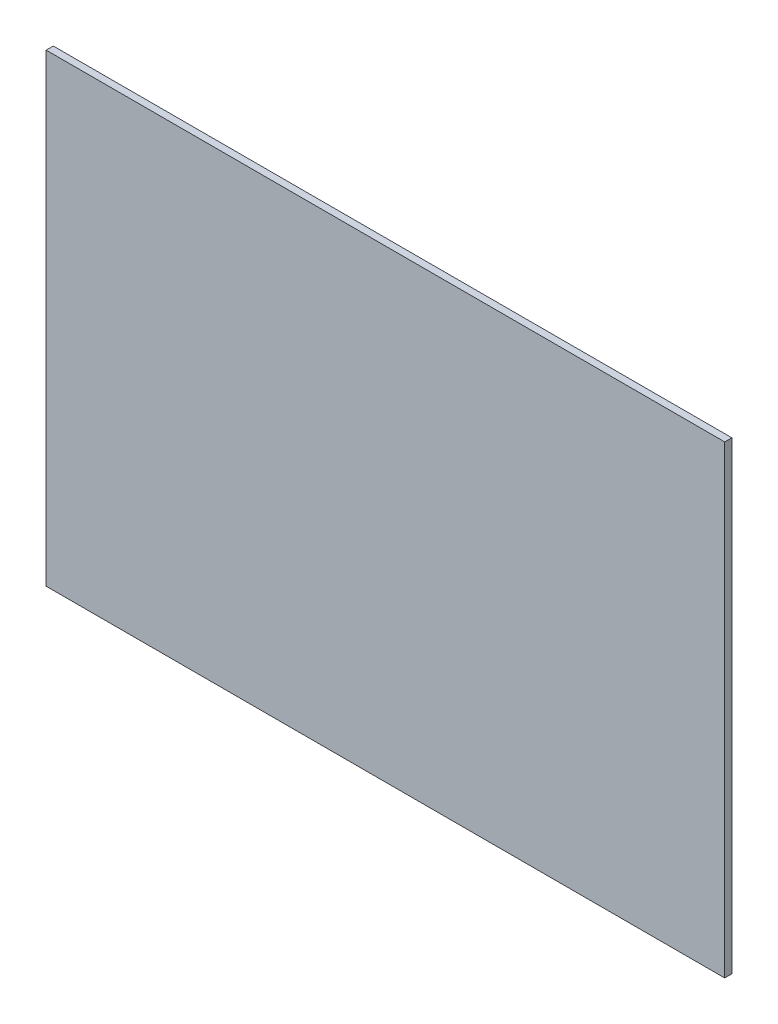
ISO-10303-21;
HEADER;
FILE_DESCRIPTION(('STEP AP214'),'2;1');
FILE_NAME('part.step','',(''),(''),'','','');
FILE_SCHEMA(('AUTOMOTIVE_DESIGN { 1 0 10303 214 1 1 1 1 }'));
ENDSEC;
DATA;
#1=APPLICATION_CONTEXT('core data for automotive mechanical design processes');
#2=APPLICATION_PROTOCOL_DEFINITION('international standard','automotive_design',2000,#1);
#3=PRODUCT_CONTEXT('',#1,'mechanical');
#4=PRODUCT('Part','Part','',(#3));
#5=PRODUCT_RELATED_PRODUCT_CATEGORY('part','',(#4));
#6=PRODUCT_DEFINITION_FORMATION('','',#4);
#7=PRODUCT_DEFINITION_CONTEXT('part definition',#1,'design');
#8=PRODUCT_DEFINITION('design','',#6,#7);
#9=PRODUCT_DEFINITION_SHAPE('','',#8);
#10=(LENGTH_UNIT() NAMED_UNIT(*) SI_UNIT(.MILLI.,.METRE.));
#11=(NAMED_UNIT(*) PLANE_ANGLE_UNIT() SI_UNIT($,.RADIAN.));
#12=(NAMED_UNIT(*) SI_UNIT($,.STERADIAN.) SOLID_ANGLE_UNIT());
#13=UNCERTAINTY_MEASURE_WITH_UNIT(LENGTH_MEASURE(1.E-05),#10,'distance_accuracy_value','');
#14=(GEOMETRIC_REPRESENTATION_CONTEXT(3) GLOBAL_UNCERTAINTY_ASSIGNED_CONTEXT((#13)) GLOBAL_UNIT_ASSIGNED_CONTEXT((#10,
#11,#12)) REPRESENTATION_CONTEXT('',''));
#15=CARTESIAN_POINT('',(0.,0.,0.));
#16=DIRECTION('',(0.,0.,1.));
#17=DIRECTION('',(1.,0.,0.));
#18=AXIS2_PLACEMENT_3D('',#15,#16,#17);
#19=CARTESIAN_POINT('',(47.5,32.5,1.));
#20=DIRECTION('',(-1.,0.,0.));
#21=DIRECTION('',(0.,-1.,0.));
#22=AXIS2_PLACEMENT_3D('',#19,#20,#21);
#23=PLANE('',#22);
#24=DIRECTION('',(0.,1.,0.));
#25=VECTOR('',#24,1.);
#26=CARTESIAN_POINT('',(47.5,32.5,0.));
#27=LINE('',#26,#25);
#28=CARTESIAN_POINT('',(47.5,-32.5,0.));
#29=VERTEX_POINT('',#28);
#30=CARTESIAN_POINT('',(47.5,32.5,0.));
#31=VERTEX_POINT('',#30);
#32=EDGE_CURVE('E108',#29,#31,#27,.T.);
#33=ORIENTED_EDGE('',*,*,#32,.T.);
#34=DIRECTION('',(0.,0.,-1.));
#35=VECTOR('',#34,1.);
#36=CARTESIAN_POINT('',(47.5,32.5,1.));
#37=LINE('',#36,#35);
#38=CARTESIAN_POINT('',(47.5,32.5,1.));
#39=VERTEX_POINT('',#38);
#40=EDGE_CURVE('E11',#39,#31,#37,.T.);
#41=ORIENTED_EDGE('',*,*,#40,.F.);
#42=DIRECTION('',(0.,1.,0.));
#43=VECTOR('',#42,1.);
#44=CARTESIAN_POINT('',(47.5,32.5,1.));
#45=LINE('',#44,#43);
#46=CARTESIAN_POINT('',(47.5,-32.5,1.));
#47=VERTEX_POINT('',#46);
#48=EDGE_CURVE('E96',#47,#39,#45,.T.);
#49=ORIENTED_EDGE('',*,*,#48,.F.);
#50=DIRECTION('',(0.,0.,-1.));
#51=VECTOR('',#50,1.);
#52=CARTESIAN_POINT('',(47.5,-32.5,1.));
#53=LINE('',#52,#51);
#54=EDGE_CURVE('E104',#47,#29,#53,.T.);
#55=ORIENTED_EDGE('',*,*,#54,.T.);
#56=EDGE_LOOP('',(#33,#41,#49,#55));
#57=FACE_BOUND('',#56,.T.);
#58=ADVANCED_FACE('F45',(#57),#23,.F.);
#59=CARTESIAN_POINT('',(-47.5,32.5,1.));
#60=DIRECTION('',(0.,-1.,0.));
#61=DIRECTION('',(0.,0.,-1.));
#62=AXIS2_PLACEMENT_3D('',#59,#60,#61);
#63=PLANE('',#62);
#64=DIRECTION('',(-1.,0.,0.));
#65=VECTOR('',#64,1.);
#66=CARTESIAN_POINT('',(-47.5,32.5,0.));
#67=LINE('',#66,#65);
#68=CARTESIAN_POINT('',(-47.5,32.5,0.));
#69=VERTEX_POINT('',#68);
#70=EDGE_CURVE('E100',#31,#69,#67,.T.);
#71=ORIENTED_EDGE('',*,*,#70,.T.);
#72=DIRECTION('',(0.,0.,-1.));
#73=VECTOR('',#72,1.);
#74=CARTESIAN_POINT('',(-47.5,32.5,1.));
#75=LINE('',#74,#73);
#76=CARTESIAN_POINT('',(-47.5,32.5,1.));
#77=VERTEX_POINT('',#76);
#78=EDGE_CURVE('E53',#77,#69,#75,.T.);
#79=ORIENTED_EDGE('',*,*,#78,.F.);
#80=DIRECTION('',(-1.,0.,0.));
#81=VECTOR('',#80,1.);
#82=CARTESIAN_POINT('',(-47.5,32.5,1.));
#83=LINE('',#82,#81);
#84=EDGE_CURVE('E91',#39,#77,#83,.T.);
#85=ORIENTED_EDGE('',*,*,#84,.F.);
#86=ORIENTED_EDGE('',*,*,#40,.T.);
#87=EDGE_LOOP('',(#71,#79,#85,#86));
#88=FACE_BOUND('',#87,.T.);
#89=ADVANCED_FACE('F99',(#88),#63,.F.);
#90=CARTESIAN_POINT('',(-47.5,32.5,1.));
#91=DIRECTION('',(1.,0.,0.));
#92=DIRECTION('',(0.,1.,0.));
#93=AXIS2_PLACEMENT_3D('',#90,#91,#92);
#94=PLANE('',#93);
#95=DIRECTION('',(0.,-1.,0.));
#96=VECTOR('',#95,1.);
#97=CARTESIAN_POINT('',(-47.5,32.5,0.));
#98=LINE('',#97,#96);
#99=CARTESIAN_POINT('',(-47.5,-32.5,0.));
#100=VERTEX_POINT('',#99);
#101=EDGE_CURVE('E78',#69,#100,#98,.T.);
#102=ORIENTED_EDGE('',*,*,#101,.T.);
#103=DIRECTION('',(0.,0.,-1.));
#104=VECTOR('',#103,1.);
#105=CARTESIAN_POINT('',(-47.5,-32.5,1.));
#106=LINE('',#105,#104);
#107=CARTESIAN_POINT('',(-47.5,-32.5,1.));
#108=VERTEX_POINT('',#107);
#109=EDGE_CURVE('E101',#108,#100,#106,.T.);
#110=ORIENTED_EDGE('',*,*,#109,.F.);
#111=DIRECTION('',(0.,-1.,0.));
#112=VECTOR('',#111,1.);
#113=CARTESIAN_POINT('',(-47.5,32.5,1.));
#114=LINE('',#113,#112);
#115=EDGE_CURVE('E94',#77,#108,#114,.T.);
#116=ORIENTED_EDGE('',*,*,#115,.F.);
#117=ORIENTED_EDGE('',*,*,#78,.T.);
#118=EDGE_LOOP('',(#102,#110,#116,#117));
#119=FACE_BOUND('',#118,.T.);
#120=ADVANCED_FACE('F102',(#119),#94,.F.);
#121=CARTESIAN_POINT('',(-47.5,-32.5,1.));
#122=DIRECTION('',(0.,1.,0.));
#123=DIRECTION('',(0.,0.,1.));
#124=AXIS2_PLACEMENT_3D('',#121,#122,#123);
#125=PLANE('',#124);
#126=DIRECTION('',(1.,0.,0.));
#127=VECTOR('',#126,1.);
#128=CARTESIAN_POINT('',(-47.5,-32.5,0.));
#129=LINE('',#128,#127);
#130=EDGE_CURVE('E84',#100,#29,#129,.T.);
#131=ORIENTED_EDGE('',*,*,#130,.T.);
#132=ORIENTED_EDGE('',*,*,#54,.F.);
#133=DIRECTION('',(1.,0.,0.));
#134=VECTOR('',#133,1.);
#135=CARTESIAN_POINT('',(-47.5,-32.5,1.));
#136=LINE('',#135,#134);
#137=EDGE_CURVE('E61',#108,#47,#136,.T.);
#138=ORIENTED_EDGE('',*,*,#137,.F.);
#139=ORIENTED_EDGE('',*,*,#109,.T.);
#140=EDGE_LOOP('',(#131,#132,#138,#139));
#141=FACE_BOUND('',#140,.T.);
#142=ADVANCED_FACE('F115',(#141),#125,.F.);
#143=CARTESIAN_POINT('',(0.,0.,1.));
#144=DIRECTION('',(0.,0.,1.));
#145=DIRECTION('',(1.,0.,0.));
#146=AXIS2_PLACEMENT_3D('',#143,#144,#145);
#147=PLANE('',#146);
#148=ORIENTED_EDGE('',*,*,#48,.T.);
#149=ORIENTED_EDGE('',*,*,#84,.T.);
#150=ORIENTED_EDGE('',*,*,#115,.T.);
#151=ORIENTED_EDGE('',*,*,#137,.T.);
#152=EDGE_LOOP('',(#148,#149,#150,#151));
#153=FACE_BOUND('',#152,.T.);
#154=ADVANCED_FACE('F92',(#153),#147,.T.);
#155=CARTESIAN_POINT('',(0.,0.,0.));
#156=DIRECTION('',(0.,0.,1.));
#157=DIRECTION('',(1.,0.,0.));
#158=AXIS2_PLACEMENT_3D('',#155,#156,#157);
#159=PLANE('',#158);
#160=ORIENTED_EDGE('',*,*,#32,.F.);
#161=ORIENTED_EDGE('',*,*,#130,.F.);
#162=ORIENTED_EDGE('',*,*,#101,.F.);
#163=ORIENTED_EDGE('',*,*,#70,.F.);
#164=EDGE_LOOP('',(#160,#161,#162,#163));
#165=FACE_BOUND('',#164,.T.);
#166=ADVANCED_FACE('F118',(#165),#159,.F.);
#167=CLOSED_SHELL('',(#58,#89,#120,#142,#154,#166));
#168=MANIFOLD_SOLID_BREP('B2',#167);
#169=ADVANCED_BREP_SHAPE_REPRESENTATION('',(#18,#168),#14);
#170=SHAPE_DEFINITION_REPRESENTATION(#9,#169);
ENDSEC;
END-ISO-10303-21;
